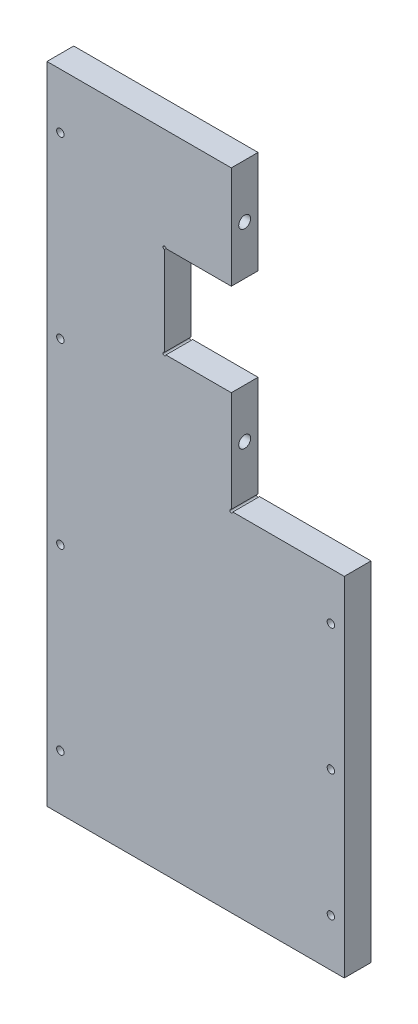
ISO-10303-21;
HEADER;
FILE_DESCRIPTION(('STEP AP214'),'2;1');
FILE_NAME('part.step','',(''),(''),'','','');
FILE_SCHEMA(('AUTOMOTIVE_DESIGN { 1 0 10303 214 1 1 1 1 }'));
ENDSEC;
DATA;
#1=APPLICATION_CONTEXT('core data for automotive mechanical design processes');
#2=APPLICATION_PROTOCOL_DEFINITION('international standard','automotive_design',2000,#1);
#3=PRODUCT_CONTEXT('',#1,'mechanical');
#4=PRODUCT('Part','Part','',(#3));
#5=PRODUCT_RELATED_PRODUCT_CATEGORY('part','',(#4));
#6=PRODUCT_DEFINITION_FORMATION('','',#4);
#7=PRODUCT_DEFINITION_CONTEXT('part definition',#1,'design');
#8=PRODUCT_DEFINITION('design','',#6,#7);
#9=PRODUCT_DEFINITION_SHAPE('','',#8);
#10=(LENGTH_UNIT() NAMED_UNIT(*) SI_UNIT(.MILLI.,.METRE.));
#11=(NAMED_UNIT(*) PLANE_ANGLE_UNIT() SI_UNIT($,.RADIAN.));
#12=(NAMED_UNIT(*) SI_UNIT($,.STERADIAN.) SOLID_ANGLE_UNIT());
#13=UNCERTAINTY_MEASURE_WITH_UNIT(LENGTH_MEASURE(1.E-05),#10,'distance_accuracy_value','');
#14=(GEOMETRIC_REPRESENTATION_CONTEXT(3) GLOBAL_UNCERTAINTY_ASSIGNED_CONTEXT((#13)) GLOBAL_UNIT_ASSIGNED_CONTEXT((#10,
#11,#12)) REPRESENTATION_CONTEXT('',''));
#15=CARTESIAN_POINT('',(0.,0.,0.));
#16=DIRECTION('',(0.,0.,1.));
#17=DIRECTION('',(1.,0.,0.));
#18=AXIS2_PLACEMENT_3D('',#15,#16,#17);
#19=CARTESIAN_POINT('',(0.,0.,18.));
#20=DIRECTION('',(1.,0.,0.));
#21=DIRECTION('',(0.,0.,-1.));
#22=AXIS2_PLACEMENT_3D('',#19,#20,#21);
#23=PLANE('',#22);
#24=DIRECTION('',(0.,-1.,0.));
#25=VECTOR('',#24,1.);
#26=CARTESIAN_POINT('',(0.,0.,0.));
#27=LINE('',#26,#25);
#28=CARTESIAN_POINT('',(0.,434.,0.));
#29=VERTEX_POINT('',#28);
#30=CARTESIAN_POINT('',(0.,0.,0.));
#31=VERTEX_POINT('',#30);
#32=EDGE_CURVE('E201',#29,#31,#27,.T.);
#33=ORIENTED_EDGE('',*,*,#32,.T.);
#34=DIRECTION('',(0.,0.,-1.));
#35=VECTOR('',#34,1.);
#36=CARTESIAN_POINT('',(0.,0.,18.));
#37=LINE('',#36,#35);
#38=CARTESIAN_POINT('',(0.,0.,18.));
#39=VERTEX_POINT('',#38);
#40=EDGE_CURVE('E177',#39,#31,#37,.T.);
#41=ORIENTED_EDGE('',*,*,#40,.F.);
#42=DIRECTION('',(0.,-1.,0.));
#43=VECTOR('',#42,1.);
#44=CARTESIAN_POINT('',(0.,0.,18.));
#45=LINE('',#44,#43);
#46=CARTESIAN_POINT('',(0.,434.,18.));
#47=VERTEX_POINT('',#46);
#48=EDGE_CURVE('E158',#47,#39,#45,.T.);
#49=ORIENTED_EDGE('',*,*,#48,.F.);
#50=DIRECTION('',(0.,0.,-1.));
#51=VECTOR('',#50,1.);
#52=CARTESIAN_POINT('',(0.,434.,18.));
#53=LINE('',#52,#51);
#54=EDGE_CURVE('E159',#47,#29,#53,.T.);
#55=ORIENTED_EDGE('',*,*,#54,.T.);
#56=EDGE_LOOP('',(#33,#41,#49,#55));
#57=FACE_BOUND('',#56,.T.);
#58=ADVANCED_FACE('F32',(#57),#23,.F.);
#59=CARTESIAN_POINT('',(0.,0.,18.));
#60=DIRECTION('',(0.,1.,0.));
#61=DIRECTION('',(0.,0.,1.));
#62=AXIS2_PLACEMENT_3D('',#59,#60,#61);
#63=PLANE('',#62);
#64=DIRECTION('',(1.,0.,0.));
#65=VECTOR('',#64,1.);
#66=CARTESIAN_POINT('',(0.,0.,0.));
#67=LINE('',#66,#65);
#68=CARTESIAN_POINT('',(200.,0.,0.));
#69=VERTEX_POINT('',#68);
#70=EDGE_CURVE('E204',#31,#69,#67,.T.);
#71=ORIENTED_EDGE('',*,*,#70,.T.);
#72=DIRECTION('',(0.,0.,-1.));
#73=VECTOR('',#72,1.);
#74=CARTESIAN_POINT('',(200.,0.,18.));
#75=LINE('',#74,#73);
#76=CARTESIAN_POINT('',(200.,0.,18.));
#77=VERTEX_POINT('',#76);
#78=EDGE_CURVE('E174',#77,#69,#75,.T.);
#79=ORIENTED_EDGE('',*,*,#78,.F.);
#80=DIRECTION('',(1.,0.,0.));
#81=VECTOR('',#80,1.);
#82=CARTESIAN_POINT('',(0.,0.,18.));
#83=LINE('',#82,#81);
#84=EDGE_CURVE('E217',#39,#77,#83,.T.);
#85=ORIENTED_EDGE('',*,*,#84,.F.);
#86=ORIENTED_EDGE('',*,*,#40,.T.);
#87=EDGE_LOOP('',(#71,#79,#85,#86));
#88=FACE_BOUND('',#87,.T.);
#89=ADVANCED_FACE('F337',(#88),#63,.F.);
#90=CARTESIAN_POINT('',(200.,0.,18.));
#91=DIRECTION('',(-1.,0.,0.));
#92=DIRECTION('',(0.,0.,1.));
#93=AXIS2_PLACEMENT_3D('',#90,#91,#92);
#94=PLANE('',#93);
#95=DIRECTION('',(0.,1.,0.));
#96=VECTOR('',#95,1.);
#97=CARTESIAN_POINT('',(200.,0.,0.));
#98=LINE('',#97,#96);
#99=CARTESIAN_POINT('',(200.,234.,0.));
#100=VERTEX_POINT('',#99);
#101=EDGE_CURVE('E147',#69,#100,#98,.T.);
#102=ORIENTED_EDGE('',*,*,#101,.T.);
#103=DIRECTION('',(0.,0.,-1.));
#104=VECTOR('',#103,1.);
#105=CARTESIAN_POINT('',(200.,234.,18.));
#106=LINE('',#105,#104);
#107=CARTESIAN_POINT('',(200.,234.,18.));
#108=VERTEX_POINT('',#107);
#109=EDGE_CURVE('E171',#108,#100,#106,.T.);
#110=ORIENTED_EDGE('',*,*,#109,.F.);
#111=DIRECTION('',(0.,1.,0.));
#112=VECTOR('',#111,1.);
#113=CARTESIAN_POINT('',(200.,0.,18.));
#114=LINE('',#113,#112);
#115=EDGE_CURVE('E216',#77,#108,#114,.T.);
#116=ORIENTED_EDGE('',*,*,#115,.F.);
#117=ORIENTED_EDGE('',*,*,#78,.T.);
#118=EDGE_LOOP('',(#102,#110,#116,#117));
#119=FACE_BOUND('',#118,.T.);
#120=ADVANCED_FACE('F209',(#119),#94,.F.);
#121=CARTESIAN_POINT('',(200.,234.,18.));
#122=DIRECTION('',(0.,-1.,0.));
#123=DIRECTION('',(0.,0.,-1.));
#124=AXIS2_PLACEMENT_3D('',#121,#122,#123);
#125=PLANE('',#124);
#126=DIRECTION('',(-1.,0.,0.));
#127=VECTOR('',#126,1.);
#128=CARTESIAN_POINT('',(200.,234.,0.));
#129=LINE('',#128,#127);
#130=CARTESIAN_POINT('',(125.,234.,0.));
#131=VERTEX_POINT('',#130);
#132=EDGE_CURVE('E143',#100,#131,#129,.T.);
#133=ORIENTED_EDGE('',*,*,#132,.T.);
#134=DIRECTION('',(0.,0.,1.));
#135=VECTOR('',#134,1.);
#136=CARTESIAN_POINT('',(125.,234.,0.));
#137=LINE('',#136,#135);
#138=CARTESIAN_POINT('',(125.,234.,18.));
#139=VERTEX_POINT('',#138);
#140=EDGE_CURVE('E46',#131,#139,#137,.T.);
#141=ORIENTED_EDGE('',*,*,#140,.T.);
#142=DIRECTION('',(-1.,0.,0.));
#143=VECTOR('',#142,1.);
#144=CARTESIAN_POINT('',(200.,234.,18.));
#145=LINE('',#144,#143);
#146=EDGE_CURVE('E193',#108,#139,#145,.T.);
#147=ORIENTED_EDGE('',*,*,#146,.F.);
#148=ORIENTED_EDGE('',*,*,#109,.T.);
#149=EDGE_LOOP('',(#133,#141,#147,#148));
#150=FACE_BOUND('',#149,.T.);
#151=ADVANCED_FACE('F214',(#150),#125,.F.);
#152=CARTESIAN_POINT('',(124.,303.,18.));
#153=DIRECTION('',(-1.,0.,0.));
#154=DIRECTION('',(0.,-1.,0.));
#155=AXIS2_PLACEMENT_3D('',#152,#153,#154);
#156=PLANE('',#155);
#157=CARTESIAN_POINT('',(124.,270.,9.00000000000006));
#158=DIRECTION('',(1.,0.,0.));
#159=DIRECTION('',(0.,0.,-1.));
#160=AXIS2_PLACEMENT_3D('',#157,#158,#159);
#161=CIRCLE('',#160,4.);
#162=CARTESIAN_POINT('',(124.,270.,5.00000000000006));
#163=VERTEX_POINT('',#162);
#164=EDGE_CURVE('E285',#163,#163,#161,.T.);
#165=ORIENTED_EDGE('',*,*,#164,.F.);
#166=EDGE_LOOP('',(#165));
#167=FACE_BOUND('',#166,.T.);
#168=DIRECTION('',(0.,1.,0.));
#169=VECTOR('',#168,1.);
#170=CARTESIAN_POINT('',(124.,303.,18.));
#171=LINE('',#170,#169);
#172=CARTESIAN_POINT('',(124.,235.,18.));
#173=VERTEX_POINT('',#172);
#174=CARTESIAN_POINT('',(124.,303.,18.));
#175=VERTEX_POINT('',#174);
#176=EDGE_CURVE('E136',#173,#175,#171,.T.);
#177=ORIENTED_EDGE('',*,*,#176,.F.);
#178=DIRECTION('',(0.,0.,1.));
#179=VECTOR('',#178,1.);
#180=CARTESIAN_POINT('',(124.,235.,0.));
#181=LINE('',#180,#179);
#182=CARTESIAN_POINT('',(124.,235.,0.));
#183=VERTEX_POINT('',#182);
#184=EDGE_CURVE('E124',#173,#183,#181,.F.);
#185=ORIENTED_EDGE('',*,*,#184,.T.);
#186=DIRECTION('',(0.,1.,0.));
#187=VECTOR('',#186,1.);
#188=CARTESIAN_POINT('',(124.,303.,0.));
#189=LINE('',#188,#187);
#190=CARTESIAN_POINT('',(124.,303.,0.));
#191=VERTEX_POINT('',#190);
#192=EDGE_CURVE('E134',#183,#191,#189,.T.);
#193=ORIENTED_EDGE('',*,*,#192,.T.);
#194=DIRECTION('',(0.,0.,-1.));
#195=VECTOR('',#194,1.);
#196=CARTESIAN_POINT('',(124.,303.,18.));
#197=LINE('',#196,#195);
#198=EDGE_CURVE('E169',#175,#191,#197,.T.);
#199=ORIENTED_EDGE('',*,*,#198,.F.);
#200=EDGE_LOOP('',(#177,#185,#193,#199));
#201=FACE_BOUND('',#200,.T.);
#202=ADVANCED_FACE('F132',(#167,#201),#156,.F.);
#203=CARTESIAN_POINT('',(79.,303.,18.));
#204=DIRECTION('',(0.,-1.,0.));
#205=DIRECTION('',(0.,0.,-1.));
#206=AXIS2_PLACEMENT_3D('',#203,#204,#205);
#207=PLANE('',#206);
#208=DIRECTION('',(-1.,0.,0.));
#209=VECTOR('',#208,1.);
#210=CARTESIAN_POINT('',(79.,303.,0.));
#211=LINE('',#210,#209);
#212=CARTESIAN_POINT('',(80.,303.,0.));
#213=VERTEX_POINT('',#212);
#214=EDGE_CURVE('E142',#191,#213,#211,.T.);
#215=ORIENTED_EDGE('',*,*,#214,.T.);
#216=DIRECTION('',(0.,0.,1.));
#217=VECTOR('',#216,1.);
#218=CARTESIAN_POINT('',(80.,303.,0.));
#219=LINE('',#218,#217);
#220=CARTESIAN_POINT('',(80.,303.,18.));
#221=VERTEX_POINT('',#220);
#222=EDGE_CURVE('E53',#213,#221,#219,.T.);
#223=ORIENTED_EDGE('',*,*,#222,.T.);
#224=DIRECTION('',(-1.,0.,0.));
#225=VECTOR('',#224,1.);
#226=CARTESIAN_POINT('',(79.,303.,18.));
#227=LINE('',#226,#225);
#228=EDGE_CURVE('E186',#175,#221,#227,.T.);
#229=ORIENTED_EDGE('',*,*,#228,.F.);
#230=ORIENTED_EDGE('',*,*,#198,.T.);
#231=EDGE_LOOP('',(#215,#223,#229,#230));
#232=FACE_BOUND('',#231,.T.);
#233=ADVANCED_FACE('F183',(#232),#207,.F.);
#234=CARTESIAN_POINT('',(79.,365.,18.));
#235=DIRECTION('',(-1.,0.,0.));
#236=DIRECTION('',(0.,-1.,0.));
#237=AXIS2_PLACEMENT_3D('',#234,#235,#236);
#238=PLANE('',#237);
#239=DIRECTION('',(0.,1.,0.));
#240=VECTOR('',#239,1.);
#241=CARTESIAN_POINT('',(79.,365.,18.));
#242=LINE('',#241,#240);
#243=CARTESIAN_POINT('',(79.,304.,18.));
#244=VERTEX_POINT('',#243);
#245=CARTESIAN_POINT('',(79.,364.,18.));
#246=VERTEX_POINT('',#245);
#247=EDGE_CURVE('E189',#244,#246,#242,.T.);
#248=ORIENTED_EDGE('',*,*,#247,.F.);
#249=DIRECTION('',(0.,0.,1.));
#250=VECTOR('',#249,1.);
#251=CARTESIAN_POINT('',(79.,304.,0.));
#252=LINE('',#251,#250);
#253=CARTESIAN_POINT('',(79.,304.,0.));
#254=VERTEX_POINT('',#253);
#255=EDGE_CURVE('E234',#244,#254,#252,.F.);
#256=ORIENTED_EDGE('',*,*,#255,.T.);
#257=DIRECTION('',(0.,1.,0.));
#258=VECTOR('',#257,1.);
#259=CARTESIAN_POINT('',(79.,365.,0.));
#260=LINE('',#259,#258);
#261=CARTESIAN_POINT('',(79.,364.,0.));
#262=VERTEX_POINT('',#261);
#263=EDGE_CURVE('E145',#254,#262,#260,.T.);
#264=ORIENTED_EDGE('',*,*,#263,.T.);
#265=DIRECTION('',(0.,0.,1.));
#266=VECTOR('',#265,1.);
#267=CARTESIAN_POINT('',(79.,364.,0.));
#268=LINE('',#267,#266);
#269=EDGE_CURVE('E205',#262,#246,#268,.T.);
#270=ORIENTED_EDGE('',*,*,#269,.T.);
#271=EDGE_LOOP('',(#248,#256,#264,#270));
#272=FACE_BOUND('',#271,.T.);
#273=ADVANCED_FACE('F325',(#272),#238,.F.);
#274=CARTESIAN_POINT('',(124.,365.,18.));
#275=DIRECTION('',(0.,1.,0.));
#276=DIRECTION('',(-1.,0.,0.));
#277=AXIS2_PLACEMENT_3D('',#274,#275,#276);
#278=PLANE('',#277);
#279=DIRECTION('',(1.,0.,0.));
#280=VECTOR('',#279,1.);
#281=CARTESIAN_POINT('',(124.,365.,18.));
#282=LINE('',#281,#280);
#283=CARTESIAN_POINT('',(80.,365.,18.));
#284=VERTEX_POINT('',#283);
#285=CARTESIAN_POINT('',(124.,365.,18.));
#286=VERTEX_POINT('',#285);
#287=EDGE_CURVE('E191',#284,#286,#282,.T.);
#288=ORIENTED_EDGE('',*,*,#287,.F.);
#289=DIRECTION('',(0.,0.,1.));
#290=VECTOR('',#289,1.);
#291=CARTESIAN_POINT('',(80.,365.,0.));
#292=LINE('',#291,#290);
#293=CARTESIAN_POINT('',(80.,365.,0.));
#294=VERTEX_POINT('',#293);
#295=EDGE_CURVE('E225',#284,#294,#292,.F.);
#296=ORIENTED_EDGE('',*,*,#295,.T.);
#297=DIRECTION('',(1.,0.,0.));
#298=VECTOR('',#297,1.);
#299=CARTESIAN_POINT('',(124.,365.,0.));
#300=LINE('',#299,#298);
#301=CARTESIAN_POINT('',(124.,365.,0.));
#302=VERTEX_POINT('',#301);
#303=EDGE_CURVE('E152',#294,#302,#300,.T.);
#304=ORIENTED_EDGE('',*,*,#303,.T.);
#305=DIRECTION('',(0.,0.,-1.));
#306=VECTOR('',#305,1.);
#307=CARTESIAN_POINT('',(124.,365.,18.));
#308=LINE('',#307,#306);
#309=EDGE_CURVE('E166',#286,#302,#308,.T.);
#310=ORIENTED_EDGE('',*,*,#309,.F.);
#311=EDGE_LOOP('',(#288,#296,#304,#310));
#312=FACE_BOUND('',#311,.T.);
#313=ADVANCED_FACE('F301',(#312),#278,.F.);
#314=CARTESIAN_POINT('',(124.,434.,18.));
#315=DIRECTION('',(-1.,0.,0.));
#316=DIRECTION('',(0.,0.,1.));
#317=AXIS2_PLACEMENT_3D('',#314,#315,#316);
#318=PLANE('',#317);
#319=CARTESIAN_POINT('',(124.,398.,9.00000000000001));
#320=DIRECTION('',(1.,0.,0.));
#321=DIRECTION('',(0.,0.,-1.));
#322=AXIS2_PLACEMENT_3D('',#319,#320,#321);
#323=CIRCLE('',#322,4.);
#324=CARTESIAN_POINT('',(124.,398.,5.));
#325=VERTEX_POINT('',#324);
#326=EDGE_CURVE('E291',#325,#325,#323,.T.);
#327=ORIENTED_EDGE('',*,*,#326,.F.);
#328=EDGE_LOOP('',(#327));
#329=FACE_BOUND('',#328,.T.);
#330=DIRECTION('',(0.,1.,0.));
#331=VECTOR('',#330,1.);
#332=CARTESIAN_POINT('',(124.,434.,0.));
#333=LINE('',#332,#331);
#334=CARTESIAN_POINT('',(124.,434.,0.));
#335=VERTEX_POINT('',#334);
#336=EDGE_CURVE('E154',#302,#335,#333,.T.);
#337=ORIENTED_EDGE('',*,*,#336,.T.);
#338=DIRECTION('',(0.,0.,-1.));
#339=VECTOR('',#338,1.);
#340=CARTESIAN_POINT('',(124.,434.,18.));
#341=LINE('',#340,#339);
#342=CARTESIAN_POINT('',(124.,434.,18.));
#343=VERTEX_POINT('',#342);
#344=EDGE_CURVE('E162',#343,#335,#341,.T.);
#345=ORIENTED_EDGE('',*,*,#344,.F.);
#346=DIRECTION('',(0.,1.,0.));
#347=VECTOR('',#346,1.);
#348=CARTESIAN_POINT('',(124.,434.,18.));
#349=LINE('',#348,#347);
#350=EDGE_CURVE('E198',#286,#343,#349,.T.);
#351=ORIENTED_EDGE('',*,*,#350,.F.);
#352=ORIENTED_EDGE('',*,*,#309,.T.);
#353=EDGE_LOOP('',(#337,#345,#351,#352));
#354=FACE_BOUND('',#353,.T.);
#355=ADVANCED_FACE('F297',(#329,#354),#318,.F.);
#356=CARTESIAN_POINT('',(124.,434.,18.));
#357=DIRECTION('',(0.,-1.,0.));
#358=DIRECTION('',(0.,0.,-1.));
#359=AXIS2_PLACEMENT_3D('',#356,#357,#358);
#360=PLANE('',#359);
#361=DIRECTION('',(-1.,0.,0.));
#362=VECTOR('',#361,1.);
#363=CARTESIAN_POINT('',(124.,434.,0.));
#364=LINE('',#363,#362);
#365=EDGE_CURVE('E156',#335,#29,#364,.T.);
#366=ORIENTED_EDGE('',*,*,#365,.T.);
#367=ORIENTED_EDGE('',*,*,#54,.F.);
#368=DIRECTION('',(-1.,0.,0.));
#369=VECTOR('',#368,1.);
#370=CARTESIAN_POINT('',(124.,434.,18.));
#371=LINE('',#370,#369);
#372=EDGE_CURVE('E163',#343,#47,#371,.T.);
#373=ORIENTED_EDGE('',*,*,#372,.F.);
#374=ORIENTED_EDGE('',*,*,#344,.T.);
#375=EDGE_LOOP('',(#366,#367,#373,#374));
#376=FACE_BOUND('',#375,.T.);
#377=ADVANCED_FACE('F300',(#376),#360,.F.);
#378=CARTESIAN_POINT('',(0.,0.,18.));
#379=DIRECTION('',(0.,0.,1.));
#380=DIRECTION('',(1.,0.,0.));
#381=AXIS2_PLACEMENT_3D('',#378,#379,#380);
#382=PLANE('',#381);
#383=CARTESIAN_POINT('',(191.,202.,18.));
#384=DIRECTION('',(0.,0.,-1.));
#385=DIRECTION('',(-1.,0.,0.));
#386=AXIS2_PLACEMENT_3D('',#383,#384,#385);
#387=CIRCLE('',#386,2.5);
#388=CARTESIAN_POINT('',(188.5,202.,18.));
#389=VERTEX_POINT('',#388);
#390=EDGE_CURVE('E276',#389,#389,#387,.T.);
#391=ORIENTED_EDGE('',*,*,#390,.T.);
#392=EDGE_LOOP('',(#391));
#393=FACE_BOUND('',#392,.T.);
#394=CARTESIAN_POINT('',(191.,117.,18.));
#395=DIRECTION('',(0.,0.,-1.));
#396=DIRECTION('',(-1.,0.,0.));
#397=AXIS2_PLACEMENT_3D('',#394,#395,#396);
#398=CIRCLE('',#397,2.5);
#399=CARTESIAN_POINT('',(188.5,117.,18.));
#400=VERTEX_POINT('',#399);
#401=EDGE_CURVE('E270',#400,#400,#398,.T.);
#402=ORIENTED_EDGE('',*,*,#401,.T.);
#403=EDGE_LOOP('',(#402));
#404=FACE_BOUND('',#403,.T.);
#405=CARTESIAN_POINT('',(191.,32.,18.));
#406=DIRECTION('',(0.,0.,-1.));
#407=DIRECTION('',(-1.,0.,0.));
#408=AXIS2_PLACEMENT_3D('',#405,#406,#407);
#409=CIRCLE('',#408,2.5);
#410=CARTESIAN_POINT('',(188.5,32.,18.));
#411=VERTEX_POINT('',#410);
#412=EDGE_CURVE('E264',#411,#411,#409,.T.);
#413=ORIENTED_EDGE('',*,*,#412,.T.);
#414=EDGE_LOOP('',(#413));
#415=FACE_BOUND('',#414,.T.);
#416=CARTESIAN_POINT('',(9.,397.,18.));
#417=DIRECTION('',(0.,0.,1.));
#418=DIRECTION('',(1.,0.,0.));
#419=AXIS2_PLACEMENT_3D('',#416,#417,#418);
#420=CIRCLE('',#419,2.49999999999999);
#421=CARTESIAN_POINT('',(11.5,397.,18.));
#422=VERTEX_POINT('',#421);
#423=EDGE_CURVE('E261',#422,#422,#420,.T.);
#424=ORIENTED_EDGE('',*,*,#423,.F.);
#425=EDGE_LOOP('',(#424));
#426=FACE_BOUND('',#425,.T.);
#427=CARTESIAN_POINT('',(9.,277.,18.));
#428=DIRECTION('',(0.,0.,1.));
#429=DIRECTION('',(1.,0.,0.));
#430=AXIS2_PLACEMENT_3D('',#427,#428,#429);
#431=CIRCLE('',#430,2.49999999999999);
#432=CARTESIAN_POINT('',(11.5,277.,18.));
#433=VERTEX_POINT('',#432);
#434=EDGE_CURVE('E255',#433,#433,#431,.T.);
#435=ORIENTED_EDGE('',*,*,#434,.F.);
#436=EDGE_LOOP('',(#435));
#437=FACE_BOUND('',#436,.T.);
#438=CARTESIAN_POINT('',(9.,157.,18.));
#439=DIRECTION('',(0.,0.,1.));
#440=DIRECTION('',(1.,0.,0.));
#441=AXIS2_PLACEMENT_3D('',#438,#439,#440);
#442=CIRCLE('',#441,2.49999999999999);
#443=CARTESIAN_POINT('',(11.5,157.,18.));
#444=VERTEX_POINT('',#443);
#445=EDGE_CURVE('E249',#444,#444,#442,.T.);
#446=ORIENTED_EDGE('',*,*,#445,.F.);
#447=EDGE_LOOP('',(#446));
#448=FACE_BOUND('',#447,.T.);
#449=CARTESIAN_POINT('',(9.,37.,18.));
#450=DIRECTION('',(0.,0.,1.));
#451=DIRECTION('',(1.,0.,0.));
#452=AXIS2_PLACEMENT_3D('',#449,#450,#451);
#453=CIRCLE('',#452,2.49999999999999);
#454=CARTESIAN_POINT('',(11.5,37.,18.));
#455=VERTEX_POINT('',#454);
#456=EDGE_CURVE('E243',#455,#455,#453,.T.);
#457=ORIENTED_EDGE('',*,*,#456,.F.);
#458=EDGE_LOOP('',(#457));
#459=FACE_BOUND('',#458,.T.);
#460=CARTESIAN_POINT('',(124.,234.,18.));
#461=DIRECTION('',(0.,0.,1.));
#462=DIRECTION('',(1.,0.,0.));
#463=AXIS2_PLACEMENT_3D('',#460,#461,#462);
#464=CIRCLE('',#463,0.999999999999985);
#465=EDGE_CURVE('E137',#173,#139,#464,.T.);
#466=ORIENTED_EDGE('',*,*,#465,.F.);
#467=ORIENTED_EDGE('',*,*,#176,.T.);
#468=ORIENTED_EDGE('',*,*,#228,.T.);
#469=CARTESIAN_POINT('',(79.,303.,18.));
#470=DIRECTION('',(0.,0.,1.));
#471=DIRECTION('',(1.,0.,0.));
#472=AXIS2_PLACEMENT_3D('',#469,#470,#471);
#473=CIRCLE('',#472,0.999999999999998);
#474=EDGE_CURVE('E236',#244,#221,#473,.T.);
#475=ORIENTED_EDGE('',*,*,#474,.F.);
#476=ORIENTED_EDGE('',*,*,#247,.T.);
#477=CARTESIAN_POINT('',(79.,365.,18.));
#478=DIRECTION('',(0.,0.,1.));
#479=DIRECTION('',(1.,0.,0.));
#480=AXIS2_PLACEMENT_3D('',#477,#478,#479);
#481=CIRCLE('',#480,0.999999999999998);
#482=EDGE_CURVE('E229',#284,#246,#481,.T.);
#483=ORIENTED_EDGE('',*,*,#482,.F.);
#484=ORIENTED_EDGE('',*,*,#287,.T.);
#485=ORIENTED_EDGE('',*,*,#350,.T.);
#486=ORIENTED_EDGE('',*,*,#372,.T.);
#487=ORIENTED_EDGE('',*,*,#48,.T.);
#488=ORIENTED_EDGE('',*,*,#84,.T.);
#489=ORIENTED_EDGE('',*,*,#115,.T.);
#490=ORIENTED_EDGE('',*,*,#146,.T.);
#491=EDGE_LOOP('',(#466,#467,#468,#475,#476,#483,#484,#485,#486,#487,#488,#489,#490));
#492=FACE_BOUND('',#491,.T.);
#493=ADVANCED_FACE('F316',(#393,#404,#415,#426,#437,#448,#459,#492),#382,.T.);
#494=CARTESIAN_POINT('',(0.,0.,0.));
#495=DIRECTION('',(0.,0.,1.));
#496=DIRECTION('',(1.,0.,0.));
#497=AXIS2_PLACEMENT_3D('',#494,#495,#496);
#498=PLANE('',#497);
#499=CARTESIAN_POINT('',(191.,202.,0.));
#500=DIRECTION('',(0.,0.,-1.));
#501=DIRECTION('',(-1.,0.,0.));
#502=AXIS2_PLACEMENT_3D('',#499,#500,#501);
#503=CIRCLE('',#502,2.5);
#504=CARTESIAN_POINT('',(188.5,202.,0.));
#505=VERTEX_POINT('',#504);
#506=EDGE_CURVE('E279',#505,#505,#503,.T.);
#507=ORIENTED_EDGE('',*,*,#506,.F.);
#508=EDGE_LOOP('',(#507));
#509=FACE_BOUND('',#508,.T.);
#510=CARTESIAN_POINT('',(191.,117.,0.));
#511=DIRECTION('',(0.,0.,-1.));
#512=DIRECTION('',(-1.,0.,0.));
#513=AXIS2_PLACEMENT_3D('',#510,#511,#512);
#514=CIRCLE('',#513,2.5);
#515=CARTESIAN_POINT('',(188.5,117.,0.));
#516=VERTEX_POINT('',#515);
#517=EDGE_CURVE('E273',#516,#516,#514,.T.);
#518=ORIENTED_EDGE('',*,*,#517,.F.);
#519=EDGE_LOOP('',(#518));
#520=FACE_BOUND('',#519,.T.);
#521=CARTESIAN_POINT('',(191.,32.,0.));
#522=DIRECTION('',(0.,0.,-1.));
#523=DIRECTION('',(-1.,0.,0.));
#524=AXIS2_PLACEMENT_3D('',#521,#522,#523);
#525=CIRCLE('',#524,2.5);
#526=CARTESIAN_POINT('',(188.5,32.,0.));
#527=VERTEX_POINT('',#526);
#528=EDGE_CURVE('E267',#527,#527,#525,.T.);
#529=ORIENTED_EDGE('',*,*,#528,.F.);
#530=EDGE_LOOP('',(#529));
#531=FACE_BOUND('',#530,.T.);
#532=CARTESIAN_POINT('',(9.,397.,0.));
#533=DIRECTION('',(0.,0.,1.));
#534=DIRECTION('',(1.,0.,0.));
#535=AXIS2_PLACEMENT_3D('',#532,#533,#534);
#536=CIRCLE('',#535,2.49999999999999);
#537=CARTESIAN_POINT('',(11.5,397.,0.));
#538=VERTEX_POINT('',#537);
#539=EDGE_CURVE('E258',#538,#538,#536,.T.);
#540=ORIENTED_EDGE('',*,*,#539,.T.);
#541=EDGE_LOOP('',(#540));
#542=FACE_BOUND('',#541,.T.);
#543=CARTESIAN_POINT('',(9.,277.,0.));
#544=DIRECTION('',(0.,0.,1.));
#545=DIRECTION('',(1.,0.,0.));
#546=AXIS2_PLACEMENT_3D('',#543,#544,#545);
#547=CIRCLE('',#546,2.49999999999999);
#548=CARTESIAN_POINT('',(11.5,277.,0.));
#549=VERTEX_POINT('',#548);
#550=EDGE_CURVE('E252',#549,#549,#547,.T.);
#551=ORIENTED_EDGE('',*,*,#550,.T.);
#552=EDGE_LOOP('',(#551));
#553=FACE_BOUND('',#552,.T.);
#554=CARTESIAN_POINT('',(9.,157.,0.));
#555=DIRECTION('',(0.,0.,1.));
#556=DIRECTION('',(1.,0.,0.));
#557=AXIS2_PLACEMENT_3D('',#554,#555,#556);
#558=CIRCLE('',#557,2.49999999999999);
#559=CARTESIAN_POINT('',(11.5,157.,0.));
#560=VERTEX_POINT('',#559);
#561=EDGE_CURVE('E246',#560,#560,#558,.T.);
#562=ORIENTED_EDGE('',*,*,#561,.T.);
#563=EDGE_LOOP('',(#562));
#564=FACE_BOUND('',#563,.T.);
#565=CARTESIAN_POINT('',(9.,37.,0.));
#566=DIRECTION('',(0.,0.,1.));
#567=DIRECTION('',(1.,0.,0.));
#568=AXIS2_PLACEMENT_3D('',#565,#566,#567);
#569=CIRCLE('',#568,2.49999999999999);
#570=CARTESIAN_POINT('',(11.5,37.,0.));
#571=VERTEX_POINT('',#570);
#572=EDGE_CURVE('E240',#571,#571,#569,.T.);
#573=ORIENTED_EDGE('',*,*,#572,.T.);
#574=EDGE_LOOP('',(#573));
#575=FACE_BOUND('',#574,.T.);
#576=ORIENTED_EDGE('',*,*,#192,.F.);
#577=CARTESIAN_POINT('',(124.,234.,0.));
#578=DIRECTION('',(0.,0.,1.));
#579=DIRECTION('',(1.,0.,0.));
#580=AXIS2_PLACEMENT_3D('',#577,#578,#579);
#581=CIRCLE('',#580,0.999999999999985);
#582=EDGE_CURVE('E11',#183,#131,#581,.T.);
#583=ORIENTED_EDGE('',*,*,#582,.T.);
#584=ORIENTED_EDGE('',*,*,#132,.F.);
#585=ORIENTED_EDGE('',*,*,#101,.F.);
#586=ORIENTED_EDGE('',*,*,#70,.F.);
#587=ORIENTED_EDGE('',*,*,#32,.F.);
#588=ORIENTED_EDGE('',*,*,#365,.F.);
#589=ORIENTED_EDGE('',*,*,#336,.F.);
#590=ORIENTED_EDGE('',*,*,#303,.F.);
#591=CARTESIAN_POINT('',(79.,365.,0.));
#592=DIRECTION('',(0.,0.,1.));
#593=DIRECTION('',(1.,0.,0.));
#594=AXIS2_PLACEMENT_3D('',#591,#592,#593);
#595=CIRCLE('',#594,0.999999999999998);
#596=EDGE_CURVE('E228',#294,#262,#595,.T.);
#597=ORIENTED_EDGE('',*,*,#596,.T.);
#598=ORIENTED_EDGE('',*,*,#263,.F.);
#599=CARTESIAN_POINT('',(79.,303.,0.));
#600=DIRECTION('',(0.,0.,1.));
#601=DIRECTION('',(1.,0.,0.));
#602=AXIS2_PLACEMENT_3D('',#599,#600,#601);
#603=CIRCLE('',#602,0.999999999999998);
#604=EDGE_CURVE('E39',#254,#213,#603,.T.);
#605=ORIENTED_EDGE('',*,*,#604,.T.);
#606=ORIENTED_EDGE('',*,*,#214,.F.);
#607=EDGE_LOOP('',(#576,#583,#584,#585,#586,#587,#588,#589,#590,#597,#598,#605,#606));
#608=FACE_BOUND('',#607,.T.);
#609=ADVANCED_FACE('F140',(#509,#520,#531,#542,#553,#564,#575,#608),#498,.F.);
#610=CARTESIAN_POINT('',(79.,365.,0.));
#611=DIRECTION('',(0.,0.,1.));
#612=DIRECTION('',(1.,0.,0.));
#613=AXIS2_PLACEMENT_3D('',#610,#611,#612);
#614=CYLINDRICAL_SURFACE('',#613,0.999999999999998);
#615=ORIENTED_EDGE('',*,*,#596,.F.);
#616=ORIENTED_EDGE('',*,*,#295,.F.);
#617=ORIENTED_EDGE('',*,*,#482,.T.);
#618=ORIENTED_EDGE('',*,*,#269,.F.);
#619=EDGE_LOOP('',(#615,#616,#617,#618));
#620=FACE_BOUND('',#619,.T.);
#621=ADVANCED_FACE('F322',(#620),#614,.F.);
#622=CARTESIAN_POINT('',(79.,303.,0.));
#623=DIRECTION('',(0.,0.,1.));
#624=DIRECTION('',(1.,0.,0.));
#625=AXIS2_PLACEMENT_3D('',#622,#623,#624);
#626=CYLINDRICAL_SURFACE('',#625,0.999999999999998);
#627=ORIENTED_EDGE('',*,*,#604,.F.);
#628=ORIENTED_EDGE('',*,*,#255,.F.);
#629=ORIENTED_EDGE('',*,*,#474,.T.);
#630=ORIENTED_EDGE('',*,*,#222,.F.);
#631=EDGE_LOOP('',(#627,#628,#629,#630));
#632=FACE_BOUND('',#631,.T.);
#633=ADVANCED_FACE('F326',(#632),#626,.F.);
#634=CARTESIAN_POINT('',(124.,234.,0.));
#635=DIRECTION('',(0.,0.,1.));
#636=DIRECTION('',(1.,0.,0.));
#637=AXIS2_PLACEMENT_3D('',#634,#635,#636);
#638=CYLINDRICAL_SURFACE('',#637,0.999999999999985);
#639=ORIENTED_EDGE('',*,*,#582,.F.);
#640=ORIENTED_EDGE('',*,*,#184,.F.);
#641=ORIENTED_EDGE('',*,*,#465,.T.);
#642=ORIENTED_EDGE('',*,*,#140,.F.);
#643=EDGE_LOOP('',(#639,#640,#641,#642));
#644=FACE_BOUND('',#643,.T.);
#645=ADVANCED_FACE('F123',(#644),#638,.F.);
#646=CARTESIAN_POINT('',(9.,37.,18.));
#647=DIRECTION('',(0.,0.,1.));
#648=DIRECTION('',(1.,0.,0.));
#649=AXIS2_PLACEMENT_3D('',#646,#647,#648);
#650=CYLINDRICAL_SURFACE('',#649,2.49999999999999);
#651=ORIENTED_EDGE('',*,*,#572,.F.);
#652=EDGE_LOOP('',(#651));
#653=FACE_BOUND('',#652,.T.);
#654=ORIENTED_EDGE('',*,*,#456,.T.);
#655=EDGE_LOOP('',(#654));
#656=FACE_BOUND('',#655,.T.);
#657=ADVANCED_FACE('F333',(#653,#656),#650,.F.);
#658=CARTESIAN_POINT('',(9.,157.,18.));
#659=DIRECTION('',(0.,0.,1.));
#660=DIRECTION('',(1.,0.,0.));
#661=AXIS2_PLACEMENT_3D('',#658,#659,#660);
#662=CYLINDRICAL_SURFACE('',#661,2.49999999999999);
#663=ORIENTED_EDGE('',*,*,#561,.F.);
#664=EDGE_LOOP('',(#663));
#665=FACE_BOUND('',#664,.T.);
#666=ORIENTED_EDGE('',*,*,#445,.T.);
#667=EDGE_LOOP('',(#666));
#668=FACE_BOUND('',#667,.T.);
#669=ADVANCED_FACE('F383',(#665,#668),#662,.F.);
#670=CARTESIAN_POINT('',(9.,277.,18.));
#671=DIRECTION('',(0.,0.,1.));
#672=DIRECTION('',(1.,0.,0.));
#673=AXIS2_PLACEMENT_3D('',#670,#671,#672);
#674=CYLINDRICAL_SURFACE('',#673,2.49999999999999);
#675=ORIENTED_EDGE('',*,*,#550,.F.);
#676=EDGE_LOOP('',(#675));
#677=FACE_BOUND('',#676,.T.);
#678=ORIENTED_EDGE('',*,*,#434,.T.);
#679=EDGE_LOOP('',(#678));
#680=FACE_BOUND('',#679,.T.);
#681=ADVANCED_FACE('F389',(#677,#680),#674,.F.);
#682=CARTESIAN_POINT('',(9.,397.,18.));
#683=DIRECTION('',(0.,0.,1.));
#684=DIRECTION('',(1.,0.,0.));
#685=AXIS2_PLACEMENT_3D('',#682,#683,#684);
#686=CYLINDRICAL_SURFACE('',#685,2.49999999999999);
#687=ORIENTED_EDGE('',*,*,#539,.F.);
#688=EDGE_LOOP('',(#687));
#689=FACE_BOUND('',#688,.T.);
#690=ORIENTED_EDGE('',*,*,#423,.T.);
#691=EDGE_LOOP('',(#690));
#692=FACE_BOUND('',#691,.T.);
#693=ADVANCED_FACE('F396',(#689,#692),#686,.F.);
#694=CARTESIAN_POINT('',(191.,32.,0.));
#695=DIRECTION('',(0.,0.,-1.));
#696=DIRECTION('',(-1.,0.,0.));
#697=AXIS2_PLACEMENT_3D('',#694,#695,#696);
#698=CYLINDRICAL_SURFACE('',#697,2.5);
#699=ORIENTED_EDGE('',*,*,#412,.F.);
#700=EDGE_LOOP('',(#699));
#701=FACE_BOUND('',#700,.T.);
#702=ORIENTED_EDGE('',*,*,#528,.T.);
#703=EDGE_LOOP('',(#702));
#704=FACE_BOUND('',#703,.T.);
#705=ADVANCED_FACE('F400',(#701,#704),#698,.F.);
#706=CARTESIAN_POINT('',(191.,117.,0.));
#707=DIRECTION('',(0.,0.,-1.));
#708=DIRECTION('',(-1.,0.,0.));
#709=AXIS2_PLACEMENT_3D('',#706,#707,#708);
#710=CYLINDRICAL_SURFACE('',#709,2.5);
#711=ORIENTED_EDGE('',*,*,#401,.F.);
#712=EDGE_LOOP('',(#711));
#713=FACE_BOUND('',#712,.T.);
#714=ORIENTED_EDGE('',*,*,#517,.T.);
#715=EDGE_LOOP('',(#714));
#716=FACE_BOUND('',#715,.T.);
#717=ADVANCED_FACE('F404',(#713,#716),#710,.F.);
#718=CARTESIAN_POINT('',(191.,202.,0.));
#719=DIRECTION('',(0.,0.,-1.));
#720=DIRECTION('',(-1.,0.,0.));
#721=AXIS2_PLACEMENT_3D('',#718,#719,#720);
#722=CYLINDRICAL_SURFACE('',#721,2.5);
#723=ORIENTED_EDGE('',*,*,#390,.F.);
#724=EDGE_LOOP('',(#723));
#725=FACE_BOUND('',#724,.T.);
#726=ORIENTED_EDGE('',*,*,#506,.T.);
#727=EDGE_LOOP('',(#726));
#728=FACE_BOUND('',#727,.T.);
#729=ADVANCED_FACE('F408',(#725,#728),#722,.F.);
#730=CARTESIAN_POINT('',(98.,270.,9.00000000000006));
#731=DIRECTION('',(-1.,0.,0.));
#732=DIRECTION('',(0.,0.,1.));
#733=AXIS2_PLACEMENT_3D('',#730,#731,#732);
#734=PLANE('',#733);
#735=CARTESIAN_POINT('',(98.,270.,9.00000000000006));
#736=DIRECTION('',(1.,0.,0.));
#737=DIRECTION('',(0.,0.,-1.));
#738=AXIS2_PLACEMENT_3D('',#735,#736,#737);
#739=CIRCLE('',#738,4.);
#740=CARTESIAN_POINT('',(98.,270.,5.00000000000006));
#741=VERTEX_POINT('',#740);
#742=EDGE_CURVE('E282',#741,#741,#739,.T.);
#743=ORIENTED_EDGE('',*,*,#742,.T.);
#744=EDGE_LOOP('',(#743));
#745=FACE_BOUND('',#744,.T.);
#746=ADVANCED_FACE('F412',(#745),#734,.F.);
#747=CARTESIAN_POINT('',(124.,270.,9.00000000000006));
#748=DIRECTION('',(1.,0.,0.));
#749=DIRECTION('',(0.,0.,-1.));
#750=AXIS2_PLACEMENT_3D('',#747,#748,#749);
#751=CYLINDRICAL_SURFACE('',#750,4.);
#752=ORIENTED_EDGE('',*,*,#742,.F.);
#753=EDGE_LOOP('',(#752));
#754=FACE_BOUND('',#753,.T.);
#755=ORIENTED_EDGE('',*,*,#164,.T.);
#756=EDGE_LOOP('',(#755));
#757=FACE_BOUND('',#756,.T.);
#758=ADVANCED_FACE('F416',(#754,#757),#751,.F.);
#759=CARTESIAN_POINT('',(98.,398.,9.00000000000001));
#760=DIRECTION('',(-1.,0.,0.));
#761=DIRECTION('',(0.,0.,1.));
#762=AXIS2_PLACEMENT_3D('',#759,#760,#761);
#763=PLANE('',#762);
#764=CARTESIAN_POINT('',(98.,398.,9.00000000000001));
#765=DIRECTION('',(1.,0.,0.));
#766=DIRECTION('',(0.,0.,-1.));
#767=AXIS2_PLACEMENT_3D('',#764,#765,#766);
#768=CIRCLE('',#767,4.);
#769=CARTESIAN_POINT('',(98.,398.,5.));
#770=VERTEX_POINT('',#769);
#771=EDGE_CURVE('E288',#770,#770,#768,.T.);
#772=ORIENTED_EDGE('',*,*,#771,.T.);
#773=EDGE_LOOP('',(#772));
#774=FACE_BOUND('',#773,.T.);
#775=ADVANCED_FACE('F420',(#774),#763,.F.);
#776=CARTESIAN_POINT('',(124.,398.,9.00000000000001));
#777=DIRECTION('',(1.,0.,0.));
#778=DIRECTION('',(0.,0.,-1.));
#779=AXIS2_PLACEMENT_3D('',#776,#777,#778);
#780=CYLINDRICAL_SURFACE('',#779,4.);
#781=ORIENTED_EDGE('',*,*,#771,.F.);
#782=EDGE_LOOP('',(#781));
#783=FACE_BOUND('',#782,.T.);
#784=ORIENTED_EDGE('',*,*,#326,.T.);
#785=EDGE_LOOP('',(#784));
#786=FACE_BOUND('',#785,.T.);
#787=ADVANCED_FACE('F295',(#783,#786),#780,.F.);
#788=CLOSED_SHELL('',(#58,#89,#120,#151,#202,#233,#273,#313,#355,#377,#493,#609,#621,#633,#645,
#657,#669,#681,#693,#705,#717,#729,#746,#758,#775,#787));
#789=MANIFOLD_SOLID_BREP('B2',#788);
#790=ADVANCED_BREP_SHAPE_REPRESENTATION('',(#18,#789),#14);
#791=SHAPE_DEFINITION_REPRESENTATION(#9,#790);
ENDSEC;
END-ISO-10303-21;
